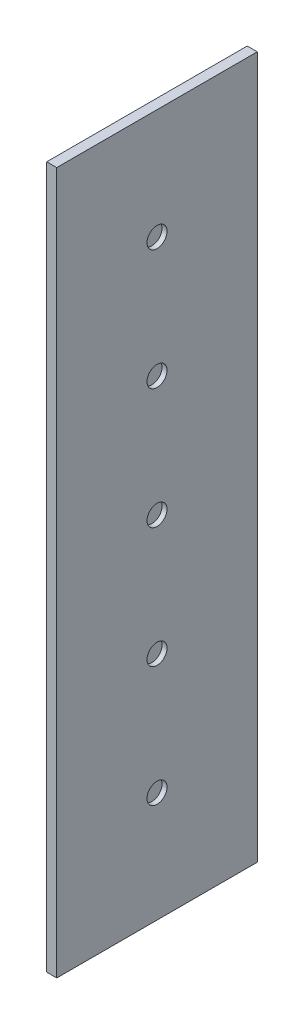
ISO-10303-21;
HEADER;
FILE_DESCRIPTION(('STEP AP214'),'2;1');
FILE_NAME('part.step','',(''),(''),'','','');
FILE_SCHEMA(('AUTOMOTIVE_DESIGN { 1 0 10303 214 1 1 1 1 }'));
ENDSEC;
DATA;
#1=APPLICATION_CONTEXT('core data for automotive mechanical design processes');
#2=APPLICATION_PROTOCOL_DEFINITION('international standard','automotive_design',2000,#1);
#3=PRODUCT_CONTEXT('',#1,'mechanical');
#4=PRODUCT('Part','Part','',(#3));
#5=PRODUCT_RELATED_PRODUCT_CATEGORY('part','',(#4));
#6=PRODUCT_DEFINITION_FORMATION('','',#4);
#7=PRODUCT_DEFINITION_CONTEXT('part definition',#1,'design');
#8=PRODUCT_DEFINITION('design','',#6,#7);
#9=PRODUCT_DEFINITION_SHAPE('','',#8);
#10=(LENGTH_UNIT() NAMED_UNIT(*) SI_UNIT(.MILLI.,.METRE.));
#11=(NAMED_UNIT(*) PLANE_ANGLE_UNIT() SI_UNIT($,.RADIAN.));
#12=(NAMED_UNIT(*) SI_UNIT($,.STERADIAN.) SOLID_ANGLE_UNIT());
#13=UNCERTAINTY_MEASURE_WITH_UNIT(LENGTH_MEASURE(1.E-05),#10,'distance_accuracy_value','');
#14=(GEOMETRIC_REPRESENTATION_CONTEXT(3) GLOBAL_UNCERTAINTY_ASSIGNED_CONTEXT((#13)) GLOBAL_UNIT_ASSIGNED_CONTEXT((#10,
#11,#12)) REPRESENTATION_CONTEXT('',''));
#15=CARTESIAN_POINT('',(0.,0.,0.));
#16=DIRECTION('',(0.,0.,1.));
#17=DIRECTION('',(1.,0.,0.));
#18=AXIS2_PLACEMENT_3D('',#15,#16,#17);
#19=CARTESIAN_POINT('',(0.,0.,200.));
#20=DIRECTION('',(1.,0.,0.));
#21=DIRECTION('',(0.,0.,-1.));
#22=AXIS2_PLACEMENT_3D('',#19,#20,#21);
#23=PLANE('',#22);
#24=DIRECTION('',(0.,-1.,0.));
#25=VECTOR('',#24,1.);
#26=CARTESIAN_POINT('',(0.,0.,0.));
#27=LINE('',#26,#25);
#28=CARTESIAN_POINT('',(0.,700.,0.));
#29=VERTEX_POINT('',#28);
#30=CARTESIAN_POINT('',(0.,0.,0.));
#31=VERTEX_POINT('',#30);
#32=EDGE_CURVE('E96',#29,#31,#27,.T.);
#33=ORIENTED_EDGE('',*,*,#32,.T.);
#34=DIRECTION('',(0.,0.,-1.));
#35=VECTOR('',#34,1.);
#36=CARTESIAN_POINT('',(0.,0.,200.));
#37=LINE('',#36,#35);
#38=CARTESIAN_POINT('',(0.,0.,200.));
#39=VERTEX_POINT('',#38);
#40=EDGE_CURVE('E11',#39,#31,#37,.T.);
#41=ORIENTED_EDGE('',*,*,#40,.F.);
#42=DIRECTION('',(0.,-1.,0.));
#43=VECTOR('',#42,1.);
#44=CARTESIAN_POINT('',(0.,0.,200.));
#45=LINE('',#44,#43);
#46=CARTESIAN_POINT('',(0.,700.,200.));
#47=VERTEX_POINT('',#46);
#48=EDGE_CURVE('E84',#47,#39,#45,.T.);
#49=ORIENTED_EDGE('',*,*,#48,.F.);
#50=DIRECTION('',(0.,0.,-1.));
#51=VECTOR('',#50,1.);
#52=CARTESIAN_POINT('',(0.,700.,200.));
#53=LINE('',#52,#51);
#54=EDGE_CURVE('E92',#47,#29,#53,.T.);
#55=ORIENTED_EDGE('',*,*,#54,.T.);
#56=EDGE_LOOP('',(#33,#41,#49,#55));
#57=FACE_BOUND('',#56,.T.);
#58=ADVANCED_FACE('F33',(#57),#23,.F.);
#59=CARTESIAN_POINT('',(0.,0.,200.));
#60=DIRECTION('',(0.,1.,0.));
#61=DIRECTION('',(0.,0.,1.));
#62=AXIS2_PLACEMENT_3D('',#59,#60,#61);
#63=PLANE('',#62);
#64=DIRECTION('',(1.,0.,0.));
#65=VECTOR('',#64,1.);
#66=CARTESIAN_POINT('',(0.,0.,0.));
#67=LINE('',#66,#65);
#68=CARTESIAN_POINT('',(10.,0.,0.));
#69=VERTEX_POINT('',#68);
#70=EDGE_CURVE('E88',#31,#69,#67,.T.);
#71=ORIENTED_EDGE('',*,*,#70,.T.);
#72=DIRECTION('',(0.,0.,-1.));
#73=VECTOR('',#72,1.);
#74=CARTESIAN_POINT('',(10.,0.,200.));
#75=LINE('',#74,#73);
#76=CARTESIAN_POINT('',(10.,0.,200.));
#77=VERTEX_POINT('',#76);
#78=EDGE_CURVE('E41',#77,#69,#75,.T.);
#79=ORIENTED_EDGE('',*,*,#78,.F.);
#80=DIRECTION('',(1.,0.,0.));
#81=VECTOR('',#80,1.);
#82=CARTESIAN_POINT('',(0.,0.,200.));
#83=LINE('',#82,#81);
#84=EDGE_CURVE('E79',#39,#77,#83,.T.);
#85=ORIENTED_EDGE('',*,*,#84,.F.);
#86=ORIENTED_EDGE('',*,*,#40,.T.);
#87=EDGE_LOOP('',(#71,#79,#85,#86));
#88=FACE_BOUND('',#87,.T.);
#89=ADVANCED_FACE('F87',(#88),#63,.F.);
#90=CARTESIAN_POINT('',(10.,0.,200.));
#91=DIRECTION('',(-1.,0.,0.));
#92=DIRECTION('',(0.,0.,1.));
#93=AXIS2_PLACEMENT_3D('',#90,#91,#92);
#94=PLANE('',#93);
#95=CARTESIAN_POINT('',(10.,590.,100.));
#96=DIRECTION('',(1.,0.,0.));
#97=DIRECTION('',(0.,0.,-1.));
#98=AXIS2_PLACEMENT_3D('',#95,#96,#97);
#99=CIRCLE('',#98,10.);
#100=CARTESIAN_POINT('',(10.,590.,90.));
#101=VERTEX_POINT('',#100);
#102=EDGE_CURVE('E134',#101,#101,#99,.T.);
#103=ORIENTED_EDGE('',*,*,#102,.F.);
#104=EDGE_LOOP('',(#103));
#105=FACE_BOUND('',#104,.T.);
#106=CARTESIAN_POINT('',(10.,470.,100.));
#107=DIRECTION('',(1.,0.,0.));
#108=DIRECTION('',(0.,0.,-1.));
#109=AXIS2_PLACEMENT_3D('',#106,#107,#108);
#110=CIRCLE('',#109,10.);
#111=CARTESIAN_POINT('',(10.,470.,90.));
#112=VERTEX_POINT('',#111);
#113=EDGE_CURVE('E128',#112,#112,#110,.T.);
#114=ORIENTED_EDGE('',*,*,#113,.F.);
#115=EDGE_LOOP('',(#114));
#116=FACE_BOUND('',#115,.T.);
#117=CARTESIAN_POINT('',(10.,350.,100.));
#118=DIRECTION('',(1.,0.,0.));
#119=DIRECTION('',(0.,0.,-1.));
#120=AXIS2_PLACEMENT_3D('',#117,#118,#119);
#121=CIRCLE('',#120,10.);
#122=CARTESIAN_POINT('',(10.,350.,90.));
#123=VERTEX_POINT('',#122);
#124=EDGE_CURVE('E122',#123,#123,#121,.T.);
#125=ORIENTED_EDGE('',*,*,#124,.F.);
#126=EDGE_LOOP('',(#125));
#127=FACE_BOUND('',#126,.T.);
#128=CARTESIAN_POINT('',(10.,230.,100.));
#129=DIRECTION('',(1.,0.,0.));
#130=DIRECTION('',(0.,0.,-1.));
#131=AXIS2_PLACEMENT_3D('',#128,#129,#130);
#132=CIRCLE('',#131,10.);
#133=CARTESIAN_POINT('',(10.,230.,90.));
#134=VERTEX_POINT('',#133);
#135=EDGE_CURVE('E116',#134,#134,#132,.T.);
#136=ORIENTED_EDGE('',*,*,#135,.F.);
#137=EDGE_LOOP('',(#136));
#138=FACE_BOUND('',#137,.T.);
#139=CARTESIAN_POINT('',(10.,110.,100.));
#140=DIRECTION('',(1.,0.,0.));
#141=DIRECTION('',(0.,0.,-1.));
#142=AXIS2_PLACEMENT_3D('',#139,#140,#141);
#143=CIRCLE('',#142,9.99999999999999);
#144=CARTESIAN_POINT('',(10.,110.,90.));
#145=VERTEX_POINT('',#144);
#146=EDGE_CURVE('E110',#145,#145,#143,.T.);
#147=ORIENTED_EDGE('',*,*,#146,.F.);
#148=EDGE_LOOP('',(#147));
#149=FACE_BOUND('',#148,.T.);
#150=DIRECTION('',(0.,1.,0.));
#151=VECTOR('',#150,1.);
#152=CARTESIAN_POINT('',(10.,0.,0.));
#153=LINE('',#152,#151);
#154=CARTESIAN_POINT('',(10.,700.,0.));
#155=VERTEX_POINT('',#154);
#156=EDGE_CURVE('E66',#69,#155,#153,.T.);
#157=ORIENTED_EDGE('',*,*,#156,.T.);
#158=DIRECTION('',(0.,0.,-1.));
#159=VECTOR('',#158,1.);
#160=CARTESIAN_POINT('',(10.,700.,200.));
#161=LINE('',#160,#159);
#162=CARTESIAN_POINT('',(10.,700.,200.));
#163=VERTEX_POINT('',#162);
#164=EDGE_CURVE('E89',#163,#155,#161,.T.);
#165=ORIENTED_EDGE('',*,*,#164,.F.);
#166=DIRECTION('',(0.,1.,0.));
#167=VECTOR('',#166,1.);
#168=CARTESIAN_POINT('',(10.,0.,200.));
#169=LINE('',#168,#167);
#170=EDGE_CURVE('E82',#77,#163,#169,.T.);
#171=ORIENTED_EDGE('',*,*,#170,.F.);
#172=ORIENTED_EDGE('',*,*,#78,.T.);
#173=EDGE_LOOP('',(#157,#165,#171,#172));
#174=FACE_BOUND('',#173,.T.);
#175=ADVANCED_FACE('F90',(#105,#116,#127,#138,#149,#174),#94,.F.);
#176=CARTESIAN_POINT('',(0.,700.,200.));
#177=DIRECTION('',(0.,-1.,0.));
#178=DIRECTION('',(0.,0.,-1.));
#179=AXIS2_PLACEMENT_3D('',#176,#177,#178);
#180=PLANE('',#179);
#181=DIRECTION('',(-1.,0.,0.));
#182=VECTOR('',#181,1.);
#183=CARTESIAN_POINT('',(0.,700.,0.));
#184=LINE('',#183,#182);
#185=EDGE_CURVE('E72',#155,#29,#184,.T.);
#186=ORIENTED_EDGE('',*,*,#185,.T.);
#187=ORIENTED_EDGE('',*,*,#54,.F.);
#188=DIRECTION('',(-1.,0.,0.));
#189=VECTOR('',#188,1.);
#190=CARTESIAN_POINT('',(0.,700.,200.));
#191=LINE('',#190,#189);
#192=EDGE_CURVE('E49',#163,#47,#191,.T.);
#193=ORIENTED_EDGE('',*,*,#192,.F.);
#194=ORIENTED_EDGE('',*,*,#164,.T.);
#195=EDGE_LOOP('',(#186,#187,#193,#194));
#196=FACE_BOUND('',#195,.T.);
#197=ADVANCED_FACE('F104',(#196),#180,.F.);
#198=CARTESIAN_POINT('',(0.,0.,200.));
#199=DIRECTION('',(0.,0.,-1.));
#200=DIRECTION('',(-1.,0.,0.));
#201=AXIS2_PLACEMENT_3D('',#198,#199,#200);
#202=PLANE('',#201);
#203=ORIENTED_EDGE('',*,*,#48,.T.);
#204=ORIENTED_EDGE('',*,*,#84,.T.);
#205=ORIENTED_EDGE('',*,*,#170,.T.);
#206=ORIENTED_EDGE('',*,*,#192,.T.);
#207=EDGE_LOOP('',(#203,#204,#205,#206));
#208=FACE_BOUND('',#207,.T.);
#209=ADVANCED_FACE('F80',(#208),#202,.F.);
#210=CARTESIAN_POINT('',(0.,0.,0.));
#211=DIRECTION('',(0.,0.,-1.));
#212=DIRECTION('',(-1.,0.,0.));
#213=AXIS2_PLACEMENT_3D('',#210,#211,#212);
#214=PLANE('',#213);
#215=ORIENTED_EDGE('',*,*,#32,.F.);
#216=ORIENTED_EDGE('',*,*,#185,.F.);
#217=ORIENTED_EDGE('',*,*,#156,.F.);
#218=ORIENTED_EDGE('',*,*,#70,.F.);
#219=EDGE_LOOP('',(#215,#216,#217,#218));
#220=FACE_BOUND('',#219,.T.);
#221=ADVANCED_FACE('F107',(#220),#214,.T.);
#222=CARTESIAN_POINT('',(5.,110.,100.));
#223=DIRECTION('',(1.,0.,0.));
#224=DIRECTION('',(0.,0.,-1.));
#225=AXIS2_PLACEMENT_3D('',#222,#223,#224);
#226=CYLINDRICAL_SURFACE('',#225,9.99999999999999);
#227=CARTESIAN_POINT('',(5.,110.,100.));
#228=DIRECTION('',(1.,0.,0.));
#229=DIRECTION('',(0.,0.,-1.));
#230=AXIS2_PLACEMENT_3D('',#227,#228,#229);
#231=CIRCLE('',#230,9.99999999999999);
#232=CARTESIAN_POINT('',(5.,110.,90.));
#233=VERTEX_POINT('',#232);
#234=EDGE_CURVE('E99',#233,#233,#231,.T.);
#235=ORIENTED_EDGE('',*,*,#234,.F.);
#236=EDGE_LOOP('',(#235));
#237=FACE_BOUND('',#236,.T.);
#238=ORIENTED_EDGE('',*,*,#146,.T.);
#239=EDGE_LOOP('',(#238));
#240=FACE_BOUND('',#239,.T.);
#241=ADVANCED_FACE('F160',(#237,#240),#226,.F.);
#242=CARTESIAN_POINT('',(5.,110.,100.));
#243=DIRECTION('',(1.,0.,0.));
#244=DIRECTION('',(0.,0.,-1.));
#245=AXIS2_PLACEMENT_3D('',#242,#243,#244);
#246=PLANE('',#245);
#247=ORIENTED_EDGE('',*,*,#234,.T.);
#248=EDGE_LOOP('',(#247));
#249=FACE_BOUND('',#248,.T.);
#250=ADVANCED_FACE('F162',(#249),#246,.T.);
#251=CARTESIAN_POINT('',(5.,230.,100.));
#252=DIRECTION('',(1.,0.,0.));
#253=DIRECTION('',(0.,0.,-1.));
#254=AXIS2_PLACEMENT_3D('',#251,#252,#253);
#255=CYLINDRICAL_SURFACE('',#254,10.);
#256=CARTESIAN_POINT('',(5.,230.,100.));
#257=DIRECTION('',(1.,0.,0.));
#258=DIRECTION('',(0.,0.,-1.));
#259=AXIS2_PLACEMENT_3D('',#256,#257,#258);
#260=CIRCLE('',#259,10.);
#261=CARTESIAN_POINT('',(5.,230.,90.));
#262=VERTEX_POINT('',#261);
#263=EDGE_CURVE('E113',#262,#262,#260,.T.);
#264=ORIENTED_EDGE('',*,*,#263,.F.);
#265=EDGE_LOOP('',(#264));
#266=FACE_BOUND('',#265,.T.);
#267=ORIENTED_EDGE('',*,*,#135,.T.);
#268=EDGE_LOOP('',(#267));
#269=FACE_BOUND('',#268,.T.);
#270=ADVANCED_FACE('F169',(#266,#269),#255,.F.);
#271=CARTESIAN_POINT('',(5.,230.,100.));
#272=DIRECTION('',(1.,0.,0.));
#273=DIRECTION('',(0.,0.,-1.));
#274=AXIS2_PLACEMENT_3D('',#271,#272,#273);
#275=PLANE('',#274);
#276=ORIENTED_EDGE('',*,*,#263,.T.);
#277=EDGE_LOOP('',(#276));
#278=FACE_BOUND('',#277,.T.);
#279=ADVANCED_FACE('F219',(#278),#275,.T.);
#280=CARTESIAN_POINT('',(5.,350.,100.));
#281=DIRECTION('',(1.,0.,0.));
#282=DIRECTION('',(0.,0.,-1.));
#283=AXIS2_PLACEMENT_3D('',#280,#281,#282);
#284=CYLINDRICAL_SURFACE('',#283,10.);
#285=CARTESIAN_POINT('',(5.,350.,100.));
#286=DIRECTION('',(1.,0.,0.));
#287=DIRECTION('',(0.,0.,-1.));
#288=AXIS2_PLACEMENT_3D('',#285,#286,#287);
#289=CIRCLE('',#288,10.);
#290=CARTESIAN_POINT('',(5.,350.,90.));
#291=VERTEX_POINT('',#290);
#292=EDGE_CURVE('E119',#291,#291,#289,.T.);
#293=ORIENTED_EDGE('',*,*,#292,.F.);
#294=EDGE_LOOP('',(#293));
#295=FACE_BOUND('',#294,.T.);
#296=ORIENTED_EDGE('',*,*,#124,.T.);
#297=EDGE_LOOP('',(#296));
#298=FACE_BOUND('',#297,.T.);
#299=ADVANCED_FACE('F229',(#295,#298),#284,.F.);
#300=CARTESIAN_POINT('',(5.,350.,100.));
#301=DIRECTION('',(1.,0.,0.));
#302=DIRECTION('',(0.,0.,-1.));
#303=AXIS2_PLACEMENT_3D('',#300,#301,#302);
#304=PLANE('',#303);
#305=ORIENTED_EDGE('',*,*,#292,.T.);
#306=EDGE_LOOP('',(#305));
#307=FACE_BOUND('',#306,.T.);
#308=ADVANCED_FACE('F239',(#307),#304,.T.);
#309=CARTESIAN_POINT('',(5.,470.,100.));
#310=DIRECTION('',(1.,0.,0.));
#311=DIRECTION('',(0.,0.,-1.));
#312=AXIS2_PLACEMENT_3D('',#309,#310,#311);
#313=CYLINDRICAL_SURFACE('',#312,10.);
#314=CARTESIAN_POINT('',(5.,470.,100.));
#315=DIRECTION('',(1.,0.,0.));
#316=DIRECTION('',(0.,0.,-1.));
#317=AXIS2_PLACEMENT_3D('',#314,#315,#316);
#318=CIRCLE('',#317,10.);
#319=CARTESIAN_POINT('',(5.,470.,90.));
#320=VERTEX_POINT('',#319);
#321=EDGE_CURVE('E125',#320,#320,#318,.T.);
#322=ORIENTED_EDGE('',*,*,#321,.F.);
#323=EDGE_LOOP('',(#322));
#324=FACE_BOUND('',#323,.T.);
#325=ORIENTED_EDGE('',*,*,#113,.T.);
#326=EDGE_LOOP('',(#325));
#327=FACE_BOUND('',#326,.T.);
#328=ADVANCED_FACE('F249',(#324,#327),#313,.F.);
#329=CARTESIAN_POINT('',(5.,470.,100.));
#330=DIRECTION('',(1.,0.,0.));
#331=DIRECTION('',(0.,0.,-1.));
#332=AXIS2_PLACEMENT_3D('',#329,#330,#331);
#333=PLANE('',#332);
#334=ORIENTED_EDGE('',*,*,#321,.T.);
#335=EDGE_LOOP('',(#334));
#336=FACE_BOUND('',#335,.T.);
#337=ADVANCED_FACE('F145',(#336),#333,.T.);
#338=CARTESIAN_POINT('',(5.,590.,100.));
#339=DIRECTION('',(1.,0.,0.));
#340=DIRECTION('',(0.,0.,-1.));
#341=AXIS2_PLACEMENT_3D('',#338,#339,#340);
#342=CYLINDRICAL_SURFACE('',#341,10.);
#343=CARTESIAN_POINT('',(5.,590.,100.));
#344=DIRECTION('',(1.,0.,0.));
#345=DIRECTION('',(0.,0.,-1.));
#346=AXIS2_PLACEMENT_3D('',#343,#344,#345);
#347=CIRCLE('',#346,10.);
#348=CARTESIAN_POINT('',(5.,590.,90.));
#349=VERTEX_POINT('',#348);
#350=EDGE_CURVE('E131',#349,#349,#347,.T.);
#351=ORIENTED_EDGE('',*,*,#350,.F.);
#352=EDGE_LOOP('',(#351));
#353=FACE_BOUND('',#352,.T.);
#354=ORIENTED_EDGE('',*,*,#102,.T.);
#355=EDGE_LOOP('',(#354));
#356=FACE_BOUND('',#355,.T.);
#357=ADVANCED_FACE('F142',(#353,#356),#342,.F.);
#358=CARTESIAN_POINT('',(5.,590.,100.));
#359=DIRECTION('',(1.,0.,0.));
#360=DIRECTION('',(0.,0.,-1.));
#361=AXIS2_PLACEMENT_3D('',#358,#359,#360);
#362=PLANE('',#361);
#363=ORIENTED_EDGE('',*,*,#350,.T.);
#364=EDGE_LOOP('',(#363));
#365=FACE_BOUND('',#364,.T.);
#366=ADVANCED_FACE('F140',(#365),#362,.T.);
#367=CLOSED_SHELL('',(#58,#89,#175,#197,#209,#221,#241,#250,#270,#279,#299,#308,#328,#337,#357,#366));
#368=MANIFOLD_SOLID_BREP('B2',#367);
#369=ADVANCED_BREP_SHAPE_REPRESENTATION('',(#18,#368),#14);
#370=SHAPE_DEFINITION_REPRESENTATION(#9,#369);
ENDSEC;
END-ISO-10303-21;
